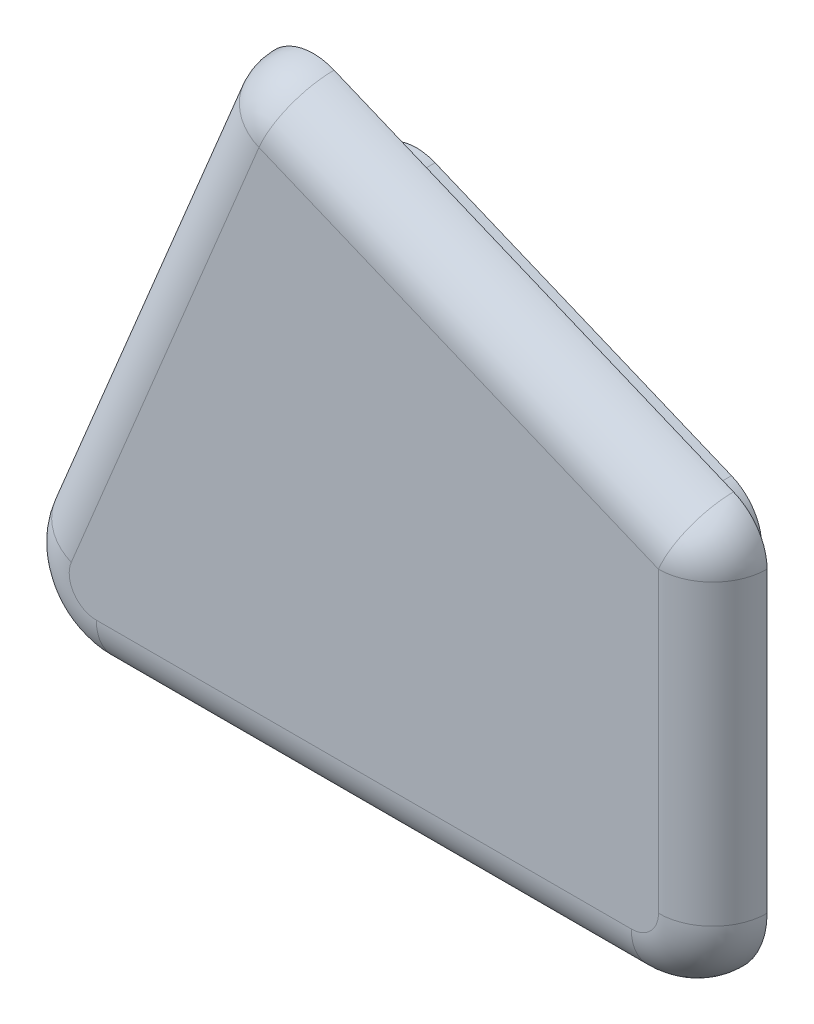
ISO-10303-21;
HEADER;
FILE_DESCRIPTION(('STEP AP214'),'2;1');
FILE_NAME('part.step','',(''),(''),'','','');
FILE_SCHEMA(('AUTOMOTIVE_DESIGN { 1 0 10303 214 1 1 1 1 }'));
ENDSEC;
DATA;
#1=APPLICATION_CONTEXT('core data for automotive mechanical design processes');
#2=APPLICATION_PROTOCOL_DEFINITION('international standard','automotive_design',2000,#1);
#3=PRODUCT_CONTEXT('',#1,'mechanical');
#4=PRODUCT('Part','Part','',(#3));
#5=PRODUCT_RELATED_PRODUCT_CATEGORY('part','',(#4));
#6=PRODUCT_DEFINITION_FORMATION('','',#4);
#7=PRODUCT_DEFINITION_CONTEXT('part definition',#1,'design');
#8=PRODUCT_DEFINITION('design','',#6,#7);
#9=PRODUCT_DEFINITION_SHAPE('','',#8);
#10=(LENGTH_UNIT() NAMED_UNIT(*) SI_UNIT(.MILLI.,.METRE.));
#11=(NAMED_UNIT(*) PLANE_ANGLE_UNIT() SI_UNIT($,.RADIAN.));
#12=(NAMED_UNIT(*) SI_UNIT($,.STERADIAN.) SOLID_ANGLE_UNIT());
#13=UNCERTAINTY_MEASURE_WITH_UNIT(LENGTH_MEASURE(1.E-05),#10,'distance_accuracy_value','');
#14=(GEOMETRIC_REPRESENTATION_CONTEXT(3) GLOBAL_UNCERTAINTY_ASSIGNED_CONTEXT((#13)) GLOBAL_UNIT_ASSIGNED_CONTEXT((#10,
#11,#12)) REPRESENTATION_CONTEXT('',''));
#15=CARTESIAN_POINT('',(0.,0.,0.));
#16=DIRECTION('',(0.,0.,1.));
#17=DIRECTION('',(1.,0.,0.));
#18=AXIS2_PLACEMENT_3D('',#15,#16,#17);
#19=CARTESIAN_POINT('',(0.,0.,0.));
#20=DIRECTION('',(0.,0.,1.));
#21=DIRECTION('',(1.,0.,0.));
#22=AXIS2_PLACEMENT_3D('',#19,#20,#21);
#23=PLANE('',#22);
#24=DIRECTION('',(0.,1.,0.));
#25=VECTOR('',#24,1.);
#26=CARTESIAN_POINT('',(32.1460132044939,0.,0.));
#27=LINE('',#26,#25);
#28=CARTESIAN_POINT('',(32.1460132044939,7.5,0.));
#29=VERTEX_POINT('',#28);
#30=CARTESIAN_POINT('',(32.1460132044939,34.934018325252,0.));
#31=VERTEX_POINT('',#30);
#32=EDGE_CURVE('E205',#29,#31,#27,.T.);
#33=ORIENTED_EDGE('',*,*,#32,.F.);
#34=CARTESIAN_POINT('',(24.6460132044939,7.5,0.));
#35=DIRECTION('',(0.,0.,1.));
#36=DIRECTION('',(1.,0.,0.));
#37=AXIS2_PLACEMENT_3D('',#34,#35,#36);
#38=CIRCLE('',#37,7.5);
#39=CARTESIAN_POINT('',(24.6460132044939,0.,0.));
#40=VERTEX_POINT('',#39);
#41=EDGE_CURVE('E237',#40,#29,#38,.T.);
#42=ORIENTED_EDGE('',*,*,#41,.F.);
#43=DIRECTION('',(1.,0.,0.));
#44=VECTOR('',#43,1.);
#45=CARTESIAN_POINT('',(0.,0.,0.));
#46=LINE('',#45,#44);
#47=CARTESIAN_POINT('',(-24.5995694192821,0.,0.));
#48=VERTEX_POINT('',#47);
#49=EDGE_CURVE('E234',#48,#40,#46,.T.);
#50=ORIENTED_EDGE('',*,*,#49,.F.);
#51=CARTESIAN_POINT('',(-24.5995694192821,7.5,0.));
#52=DIRECTION('',(0.,0.,1.));
#53=DIRECTION('',(1.,0.,0.));
#54=AXIS2_PLACEMENT_3D('',#51,#52,#53);
#55=CIRCLE('',#54,7.5);
#56=CARTESIAN_POINT('',(-31.5286659131167,10.3701257427382,0.));
#57=VERTEX_POINT('',#56);
#58=EDGE_CURVE('E231',#57,#48,#55,.T.);
#59=ORIENTED_EDGE('',*,*,#58,.F.);
#60=DIRECTION('',(-0.382683432365094,-0.923879532511285,0.));
#61=VECTOR('',#60,1.);
#62=CARTESIAN_POINT('',(-30.577792808247,12.6657364886105,0.));
#63=LINE('',#62,#61);
#64=CARTESIAN_POINT('',(-14.251310589598,52.0813512867155,0.));
#65=VERTEX_POINT('',#64);
#66=EDGE_CURVE('E228',#65,#57,#63,.T.);
#67=ORIENTED_EDGE('',*,*,#66,.F.);
#68=CARTESIAN_POINT('',(-9.6319129270416,50.16793412489,0.));
#69=DIRECTION('',(0.,0.,1.));
#70=DIRECTION('',(1.,0.,0.));
#71=AXIS2_PLACEMENT_3D('',#68,#69,#70);
#72=CIRCLE('',#71,5.);
#73=CARTESIAN_POINT('',(-7.71849576521614,54.7873317874464,0.));
#74=VERTEX_POINT('',#73);
#75=EDGE_CURVE('E225',#74,#65,#72,.T.);
#76=ORIENTED_EDGE('',*,*,#75,.F.);
#77=DIRECTION('',(-0.923879532511285,0.382683432365094,0.));
#78=VECTOR('',#77,1.);
#79=CARTESIAN_POINT('',(18.2398993804744,44.0350124606614,0.));
#80=LINE('',#79,#78);
#81=CARTESIAN_POINT('',(29.0594303663194,39.5534159878084,0.));
#82=VERTEX_POINT('',#81);
#83=EDGE_CURVE('E222',#82,#74,#80,.T.);
#84=ORIENTED_EDGE('',*,*,#83,.F.);
#85=CARTESIAN_POINT('',(27.1460132044939,34.934018325252,0.));
#86=DIRECTION('',(0.,0.,1.));
#87=DIRECTION('',(1.,0.,0.));
#88=AXIS2_PLACEMENT_3D('',#85,#86,#87);
#89=CIRCLE('',#88,5.);
#90=EDGE_CURVE('E219',#31,#82,#89,.T.);
#91=ORIENTED_EDGE('',*,*,#90,.F.);
#92=EDGE_LOOP('',(#33,#42,#50,#59,#67,#76,#84,#91));
#93=FACE_BOUND('',#92,.T.);
#94=DIRECTION('',(0.,-1.,0.));
#95=VECTOR('',#94,1.);
#96=CARTESIAN_POINT('',(26.6460132044939,0.,0.));
#97=LINE('',#96,#95);
#98=CARTESIAN_POINT('',(26.6460132044939,31.5931251356555,0.));
#99=VERTEX_POINT('',#98);
#100=CARTESIAN_POINT('',(26.6460132044939,15.,0.));
#101=VERTEX_POINT('',#100);
#102=EDGE_CURVE('E184',#99,#101,#97,.T.);
#103=ORIENTED_EDGE('',*,*,#102,.F.);
#104=CARTESIAN_POINT('',(22.1460132044939,31.5931251356555,0.));
#105=DIRECTION('',(0.,0.,1.));
#106=DIRECTION('',(1.,0.,0.));
#107=AXIS2_PLACEMENT_3D('',#104,#105,#106);
#108=CIRCLE('',#107,4.5);
#109=CARTESIAN_POINT('',(23.8680886501368,35.7505830319563,0.));
#110=VERTEX_POINT('',#109);
#111=EDGE_CURVE('E148',#99,#110,#108,.T.);
#112=ORIENTED_EDGE('',*,*,#111,.T.);
#113=DIRECTION('',(0.923879532511285,-0.382683432365094,0.));
#114=VECTOR('',#113,1.);
#115=CARTESIAN_POINT('',(16.1351405024664,38.9536750318493,0.));
#116=LINE('',#115,#114);
#117=CARTESIAN_POINT('',(-3.42160421377461,47.0543439291848,0.));
#118=VERTEX_POINT('',#117);
#119=EDGE_CURVE('E187',#118,#110,#116,.T.);
#120=ORIENTED_EDGE('',*,*,#119,.F.);
#121=CARTESIAN_POINT('',(-5.14367965941753,42.896886032884,0.));
#122=DIRECTION('',(0.,0.,1.));
#123=DIRECTION('',(1.,0.,0.));
#124=AXIS2_PLACEMENT_3D('',#121,#122,#123);
#125=CIRCLE('',#124,4.5);
#126=CARTESIAN_POINT('',(-9.30113755571831,44.6189614785269,0.));
#127=VERTEX_POINT('',#126);
#128=EDGE_CURVE('E190',#118,#127,#125,.T.);
#129=ORIENTED_EDGE('',*,*,#128,.T.);
#130=DIRECTION('',(0.382683432365094,0.923879532511285,0.));
#131=VECTOR('',#130,1.);
#132=CARTESIAN_POINT('',(-23.7142026125418,9.8227443429784,0.));
#133=LINE('',#132,#131);
#134=CARTESIAN_POINT('',(-22.7510293496796,12.1480502970953,0.));
#135=VERTEX_POINT('',#134);
#136=EDGE_CURVE('E193',#135,#127,#133,.T.);
#137=ORIENTED_EDGE('',*,*,#136,.F.);
#138=CARTESIAN_POINT('',(-19.9793907521458,11.,0.));
#139=DIRECTION('',(0.,0.,1.));
#140=DIRECTION('',(1.,0.,0.));
#141=AXIS2_PLACEMENT_3D('',#138,#139,#140);
#142=CIRCLE('',#141,3.);
#143=CARTESIAN_POINT('',(-19.9793907521458,8.,0.));
#144=VERTEX_POINT('',#143);
#145=EDGE_CURVE('E196',#135,#144,#142,.T.);
#146=ORIENTED_EDGE('',*,*,#145,.T.);
#147=DIRECTION('',(1.,0.,0.));
#148=VECTOR('',#147,1.);
#149=CARTESIAN_POINT('',(0.,8.,0.));
#150=LINE('',#149,#148);
#151=CARTESIAN_POINT('',(19.6460132044939,8.,0.));
#152=VERTEX_POINT('',#151);
#153=EDGE_CURVE('E199',#144,#152,#150,.T.);
#154=ORIENTED_EDGE('',*,*,#153,.T.);
#155=CARTESIAN_POINT('',(19.6460132044939,15.,0.));
#156=DIRECTION('',(0.,0.,1.));
#157=DIRECTION('',(1.,0.,0.));
#158=AXIS2_PLACEMENT_3D('',#155,#156,#157);
#159=CIRCLE('',#158,7.);
#160=EDGE_CURVE('E162',#152,#101,#159,.T.);
#161=ORIENTED_EDGE('',*,*,#160,.T.);
#162=EDGE_LOOP('',(#103,#112,#120,#129,#137,#146,#154,#161));
#163=FACE_BOUND('',#162,.T.);
#164=ADVANCED_FACE('F35',(#93,#163),#23,.F.);
#165=CARTESIAN_POINT('',(0.,0.,5.));
#166=DIRECTION('',(0.,0.,1.));
#167=DIRECTION('',(1.,0.,0.));
#168=AXIS2_PLACEMENT_3D('',#165,#166,#167);
#169=PLANE('',#168);
#170=DIRECTION('',(1.,0.,0.));
#171=VECTOR('',#170,1.);
#172=CARTESIAN_POINT('',(24.6460132044939,5.,5.));
#173=LINE('',#172,#171);
#174=CARTESIAN_POINT('',(-24.5995694192821,5.,5.));
#175=VERTEX_POINT('',#174);
#176=CARTESIAN_POINT('',(24.6460132044939,5.,5.));
#177=VERTEX_POINT('',#176);
#178=EDGE_CURVE('E44',#175,#177,#173,.T.);
#179=ORIENTED_EDGE('',*,*,#178,.T.);
#180=CARTESIAN_POINT('',(24.6460132044939,7.5,5.));
#181=DIRECTION('',(0.,0.,1.));
#182=DIRECTION('',(1.,0.,0.));
#183=AXIS2_PLACEMENT_3D('',#180,#181,#182);
#184=CIRCLE('',#183,2.5);
#185=CARTESIAN_POINT('',(27.1460132044939,7.5,5.));
#186=VERTEX_POINT('',#185);
#187=EDGE_CURVE('E11',#177,#186,#184,.T.);
#188=ORIENTED_EDGE('',*,*,#187,.T.);
#189=DIRECTION('',(0.,1.,0.));
#190=VECTOR('',#189,1.);
#191=CARTESIAN_POINT('',(27.1460132044939,34.934018325252,5.));
#192=LINE('',#191,#190);
#193=CARTESIAN_POINT('',(27.1460132044939,34.934018325252,5.));
#194=VERTEX_POINT('',#193);
#195=EDGE_CURVE('E240',#186,#194,#192,.T.);
#196=ORIENTED_EDGE('',*,*,#195,.T.);
#197=DIRECTION('',(-0.923879532511285,0.382683432365094,0.));
#198=VECTOR('',#197,1.);
#199=CARTESIAN_POINT('',(-9.63191292704161,50.16793412489,5.));
#200=LINE('',#199,#198);
#201=CARTESIAN_POINT('',(-9.6319129270416,50.16793412489,5.));
#202=VERTEX_POINT('',#201);
#203=EDGE_CURVE('E242',#194,#202,#200,.T.);
#204=ORIENTED_EDGE('',*,*,#203,.T.);
#205=DIRECTION('',(-0.382683432365094,-0.923879532511285,0.));
#206=VECTOR('',#205,1.);
#207=CARTESIAN_POINT('',(-26.9092682505603,8.45670858091273,5.));
#208=LINE('',#207,#206);
#209=CARTESIAN_POINT('',(-26.9092682505603,8.45670858091274,5.));
#210=VERTEX_POINT('',#209);
#211=EDGE_CURVE('E244',#202,#210,#208,.T.);
#212=ORIENTED_EDGE('',*,*,#211,.T.);
#213=CARTESIAN_POINT('',(-24.5995694192821,7.5,5.));
#214=DIRECTION('',(0.,0.,1.));
#215=DIRECTION('',(1.,0.,0.));
#216=AXIS2_PLACEMENT_3D('',#213,#214,#215);
#217=CIRCLE('',#216,2.5);
#218=EDGE_CURVE('E55',#210,#175,#217,.T.);
#219=ORIENTED_EDGE('',*,*,#218,.T.);
#220=EDGE_LOOP('',(#179,#188,#196,#204,#212,#219));
#221=FACE_BOUND('',#220,.T.);
#222=ADVANCED_FACE('F288',(#221),#169,.T.);
#223=CARTESIAN_POINT('',(26.6460132044939,0.,-5.));
#224=DIRECTION('',(-1.,0.,0.));
#225=DIRECTION('',(0.,0.,1.));
#226=AXIS2_PLACEMENT_3D('',#223,#224,#225);
#227=PLANE('',#226);
#228=ORIENTED_EDGE('',*,*,#102,.T.);
#229=DIRECTION('',(0.,0.,1.));
#230=VECTOR('',#229,1.);
#231=CARTESIAN_POINT('',(26.6460132044939,15.,-5.));
#232=LINE('',#231,#230);
#233=CARTESIAN_POINT('',(26.6460132044939,15.,-5.));
#234=VERTEX_POINT('',#233);
#235=EDGE_CURVE('E158',#234,#101,#232,.T.);
#236=ORIENTED_EDGE('',*,*,#235,.F.);
#237=DIRECTION('',(0.,-1.,0.));
#238=VECTOR('',#237,1.);
#239=CARTESIAN_POINT('',(26.6460132044939,0.,-5.));
#240=LINE('',#239,#238);
#241=CARTESIAN_POINT('',(26.6460132044939,31.5931251356555,-5.));
#242=VERTEX_POINT('',#241);
#243=EDGE_CURVE('E155',#242,#234,#240,.T.);
#244=ORIENTED_EDGE('',*,*,#243,.F.);
#245=DIRECTION('',(0.,0.,1.));
#246=VECTOR('',#245,1.);
#247=CARTESIAN_POINT('',(26.6460132044939,31.5931251356555,-5.));
#248=LINE('',#247,#246);
#249=EDGE_CURVE('E142',#242,#99,#248,.T.);
#250=ORIENTED_EDGE('',*,*,#249,.T.);
#251=EDGE_LOOP('',(#228,#236,#244,#250));
#252=FACE_BOUND('',#251,.T.);
#253=ADVANCED_FACE('F156',(#252),#227,.F.);
#254=CARTESIAN_POINT('',(19.6460132044939,15.,-5.));
#255=DIRECTION('',(0.,0.,1.));
#256=DIRECTION('',(1.,0.,0.));
#257=AXIS2_PLACEMENT_3D('',#254,#255,#256);
#258=CYLINDRICAL_SURFACE('',#257,7.);
#259=ORIENTED_EDGE('',*,*,#160,.F.);
#260=DIRECTION('',(0.,0.,1.));
#261=VECTOR('',#260,1.);
#262=CARTESIAN_POINT('',(19.6460132044939,8.,-5.));
#263=LINE('',#262,#261);
#264=CARTESIAN_POINT('',(19.6460132044939,8.,-5.));
#265=VERTEX_POINT('',#264);
#266=EDGE_CURVE('E206',#265,#152,#263,.T.);
#267=ORIENTED_EDGE('',*,*,#266,.F.);
#268=CARTESIAN_POINT('',(19.6460132044939,15.,-5.));
#269=DIRECTION('',(0.,0.,1.));
#270=DIRECTION('',(1.,0.,0.));
#271=AXIS2_PLACEMENT_3D('',#268,#269,#270);
#272=CIRCLE('',#271,7.);
#273=EDGE_CURVE('E152',#265,#234,#272,.T.);
#274=ORIENTED_EDGE('',*,*,#273,.T.);
#275=ORIENTED_EDGE('',*,*,#235,.T.);
#276=EDGE_LOOP('',(#259,#267,#274,#275));
#277=FACE_BOUND('',#276,.T.);
#278=ADVANCED_FACE('F312',(#277),#258,.T.);
#279=CARTESIAN_POINT('',(0.,8.,-5.));
#280=DIRECTION('',(0.,-1.,0.));
#281=DIRECTION('',(0.,0.,-1.));
#282=AXIS2_PLACEMENT_3D('',#279,#280,#281);
#283=PLANE('',#282);
#284=ORIENTED_EDGE('',*,*,#153,.F.);
#285=DIRECTION('',(0.,0.,1.));
#286=VECTOR('',#285,1.);
#287=CARTESIAN_POINT('',(-19.9793907521458,8.,-5.));
#288=LINE('',#287,#286);
#289=CARTESIAN_POINT('',(-19.9793907521458,8.,-5.));
#290=VERTEX_POINT('',#289);
#291=EDGE_CURVE('E208',#290,#144,#288,.T.);
#292=ORIENTED_EDGE('',*,*,#291,.F.);
#293=DIRECTION('',(1.,0.,0.));
#294=VECTOR('',#293,1.);
#295=CARTESIAN_POINT('',(0.,8.,-5.));
#296=LINE('',#295,#294);
#297=EDGE_CURVE('E180',#290,#265,#296,.T.);
#298=ORIENTED_EDGE('',*,*,#297,.T.);
#299=ORIENTED_EDGE('',*,*,#266,.T.);
#300=EDGE_LOOP('',(#284,#292,#298,#299));
#301=FACE_BOUND('',#300,.T.);
#302=ADVANCED_FACE('F330',(#301),#283,.T.);
#303=CARTESIAN_POINT('',(-19.9793907521458,11.,-5.));
#304=DIRECTION('',(0.,0.,1.));
#305=DIRECTION('',(1.,0.,0.));
#306=AXIS2_PLACEMENT_3D('',#303,#304,#305);
#307=CYLINDRICAL_SURFACE('',#306,3.);
#308=ORIENTED_EDGE('',*,*,#145,.F.);
#309=DIRECTION('',(0.,0.,1.));
#310=VECTOR('',#309,1.);
#311=CARTESIAN_POINT('',(-22.7510293496796,12.1480502970953,-5.));
#312=LINE('',#311,#310);
#313=CARTESIAN_POINT('',(-22.7510293496796,12.1480502970953,-5.));
#314=VERTEX_POINT('',#313);
#315=EDGE_CURVE('E210',#314,#135,#312,.T.);
#316=ORIENTED_EDGE('',*,*,#315,.F.);
#317=CARTESIAN_POINT('',(-19.9793907521458,11.,-5.));
#318=DIRECTION('',(0.,0.,1.));
#319=DIRECTION('',(1.,0.,0.));
#320=AXIS2_PLACEMENT_3D('',#317,#318,#319);
#321=CIRCLE('',#320,3.);
#322=EDGE_CURVE('E177',#314,#290,#321,.T.);
#323=ORIENTED_EDGE('',*,*,#322,.T.);
#324=ORIENTED_EDGE('',*,*,#291,.T.);
#325=EDGE_LOOP('',(#308,#316,#323,#324));
#326=FACE_BOUND('',#325,.T.);
#327=ADVANCED_FACE('F326',(#326),#307,.T.);
#328=CARTESIAN_POINT('',(-23.7142026125418,9.8227443429784,-5.));
#329=DIRECTION('',(0.923879532511285,-0.382683432365094,0.));
#330=DIRECTION('',(0.382683432365094,0.923879532511285,0.));
#331=AXIS2_PLACEMENT_3D('',#328,#329,#330);
#332=PLANE('',#331);
#333=ORIENTED_EDGE('',*,*,#136,.T.);
#334=DIRECTION('',(0.,0.,1.));
#335=VECTOR('',#334,1.);
#336=CARTESIAN_POINT('',(-9.30113755571831,44.6189614785269,-5.));
#337=LINE('',#336,#335);
#338=CARTESIAN_POINT('',(-9.30113755571831,44.6189614785269,-5.));
#339=VERTEX_POINT('',#338);
#340=EDGE_CURVE('E212',#339,#127,#337,.T.);
#341=ORIENTED_EDGE('',*,*,#340,.F.);
#342=DIRECTION('',(0.382683432365094,0.923879532511285,0.));
#343=VECTOR('',#342,1.);
#344=CARTESIAN_POINT('',(-23.7142026125418,9.8227443429784,-5.));
#345=LINE('',#344,#343);
#346=EDGE_CURVE('E175',#314,#339,#345,.T.);
#347=ORIENTED_EDGE('',*,*,#346,.F.);
#348=ORIENTED_EDGE('',*,*,#315,.T.);
#349=EDGE_LOOP('',(#333,#341,#347,#348));
#350=FACE_BOUND('',#349,.T.);
#351=ADVANCED_FACE('F322',(#350),#332,.F.);
#352=CARTESIAN_POINT('',(-5.14367965941753,42.896886032884,-5.));
#353=DIRECTION('',(0.,0.,1.));
#354=DIRECTION('',(1.,0.,0.));
#355=AXIS2_PLACEMENT_3D('',#352,#353,#354);
#356=CYLINDRICAL_SURFACE('',#355,4.5);
#357=ORIENTED_EDGE('',*,*,#128,.F.);
#358=DIRECTION('',(0.,0.,1.));
#359=VECTOR('',#358,1.);
#360=CARTESIAN_POINT('',(-3.42160421377461,47.0543439291848,-5.));
#361=LINE('',#360,#359);
#362=CARTESIAN_POINT('',(-3.42160421377461,47.0543439291848,-5.));
#363=VERTEX_POINT('',#362);
#364=EDGE_CURVE('E214',#363,#118,#361,.T.);
#365=ORIENTED_EDGE('',*,*,#364,.F.);
#366=CARTESIAN_POINT('',(-5.14367965941753,42.896886032884,-5.));
#367=DIRECTION('',(0.,0.,1.));
#368=DIRECTION('',(1.,0.,0.));
#369=AXIS2_PLACEMENT_3D('',#366,#367,#368);
#370=CIRCLE('',#369,4.5);
#371=EDGE_CURVE('E170',#363,#339,#370,.T.);
#372=ORIENTED_EDGE('',*,*,#371,.T.);
#373=ORIENTED_EDGE('',*,*,#340,.T.);
#374=EDGE_LOOP('',(#357,#365,#372,#373));
#375=FACE_BOUND('',#374,.T.);
#376=ADVANCED_FACE('F318',(#375),#356,.T.);
#377=CARTESIAN_POINT('',(16.1351405024664,38.9536750318493,-5.));
#378=DIRECTION('',(-0.382683432365094,-0.923879532511285,0.));
#379=DIRECTION('',(0.923879532511285,-0.382683432365094,0.));
#380=AXIS2_PLACEMENT_3D('',#377,#378,#379);
#381=PLANE('',#380);
#382=ORIENTED_EDGE('',*,*,#119,.T.);
#383=DIRECTION('',(0.,0.,1.));
#384=VECTOR('',#383,1.);
#385=CARTESIAN_POINT('',(23.8680886501368,35.7505830319563,-5.));
#386=LINE('',#385,#384);
#387=CARTESIAN_POINT('',(23.8680886501368,35.7505830319563,-5.));
#388=VERTEX_POINT('',#387);
#389=EDGE_CURVE('E151',#388,#110,#386,.T.);
#390=ORIENTED_EDGE('',*,*,#389,.F.);
#391=DIRECTION('',(0.923879532511285,-0.382683432365094,0.));
#392=VECTOR('',#391,1.);
#393=CARTESIAN_POINT('',(16.1351405024664,38.9536750318493,-5.));
#394=LINE('',#393,#392);
#395=EDGE_CURVE('E167',#363,#388,#394,.T.);
#396=ORIENTED_EDGE('',*,*,#395,.F.);
#397=ORIENTED_EDGE('',*,*,#364,.T.);
#398=EDGE_LOOP('',(#382,#390,#396,#397));
#399=FACE_BOUND('',#398,.T.);
#400=ADVANCED_FACE('F315',(#399),#381,.F.);
#401=CARTESIAN_POINT('',(22.1460132044939,31.5931251356555,-5.));
#402=DIRECTION('',(0.,0.,1.));
#403=DIRECTION('',(1.,0.,0.));
#404=AXIS2_PLACEMENT_3D('',#401,#402,#403);
#405=CYLINDRICAL_SURFACE('',#404,4.5);
#406=ORIENTED_EDGE('',*,*,#111,.F.);
#407=ORIENTED_EDGE('',*,*,#249,.F.);
#408=CARTESIAN_POINT('',(22.1460132044939,31.5931251356555,-5.));
#409=DIRECTION('',(0.,0.,1.));
#410=DIRECTION('',(1.,0.,0.));
#411=AXIS2_PLACEMENT_3D('',#408,#409,#410);
#412=CIRCLE('',#411,4.5);
#413=EDGE_CURVE('E146',#242,#388,#412,.T.);
#414=ORIENTED_EDGE('',*,*,#413,.T.);
#415=ORIENTED_EDGE('',*,*,#389,.T.);
#416=EDGE_LOOP('',(#406,#407,#414,#415));
#417=FACE_BOUND('',#416,.T.);
#418=ADVANCED_FACE('F144',(#417),#405,.T.);
#419=CARTESIAN_POINT('',(0.,0.,-5.));
#420=DIRECTION('',(0.,0.,1.));
#421=DIRECTION('',(1.,0.,0.));
#422=AXIS2_PLACEMENT_3D('',#419,#420,#421);
#423=PLANE('',#422);
#424=ORIENTED_EDGE('',*,*,#243,.T.);
#425=ORIENTED_EDGE('',*,*,#273,.F.);
#426=ORIENTED_EDGE('',*,*,#297,.F.);
#427=ORIENTED_EDGE('',*,*,#322,.F.);
#428=ORIENTED_EDGE('',*,*,#346,.T.);
#429=ORIENTED_EDGE('',*,*,#371,.F.);
#430=ORIENTED_EDGE('',*,*,#395,.T.);
#431=ORIENTED_EDGE('',*,*,#413,.F.);
#432=EDGE_LOOP('',(#424,#425,#426,#427,#428,#429,#430,#431));
#433=FACE_BOUND('',#432,.T.);
#434=ADVANCED_FACE('F164',(#433),#423,.F.);
#435=CARTESIAN_POINT('',(-9.6319129270416,50.16793412489,0.));
#436=DIRECTION('',(0.,0.,1.));
#437=DIRECTION('',(1.,0.,0.));
#438=AXIS2_PLACEMENT_3D('',#435,#436,#437);
#439=SPHERICAL_SURFACE('',#438,5.);
#440=CARTESIAN_POINT('',(-9.6319129270416,50.16793412489,0.));
#441=DIRECTION('',(0.923879532511286,-0.382683432365092,0.));
#442=DIRECTION('',(0.382683432365092,0.923879532511286,0.));
#443=AXIS2_PLACEMENT_3D('',#440,#441,#442);
#444=CIRCLE('',#443,5.);
#445=EDGE_CURVE('E263',#74,#202,#444,.T.);
#446=ORIENTED_EDGE('',*,*,#445,.F.);
#447=ORIENTED_EDGE('',*,*,#75,.T.);
#448=CARTESIAN_POINT('',(-9.6319129270416,50.16793412489,0.));
#449=DIRECTION('',(-0.382683432365094,-0.923879532511285,0.));
#450=DIRECTION('',(0.923879532511285,-0.382683432365094,0.));
#451=AXIS2_PLACEMENT_3D('',#448,#449,#450);
#452=CIRCLE('',#451,5.);
#453=EDGE_CURVE('E39',#202,#65,#452,.T.);
#454=ORIENTED_EDGE('',*,*,#453,.F.);
#455=EDGE_LOOP('',(#446,#447,#454));
#456=FACE_BOUND('',#455,.T.);
#457=ADVANCED_FACE('F37',(#456),#439,.T.);
#458=CARTESIAN_POINT('',(-25.9583951456905,10.7523193267851,0.));
#459=DIRECTION('',(0.382683432365094,0.923879532511285,0.));
#460=DIRECTION('',(-0.923879532511285,0.382683432365094,0.));
#461=AXIS2_PLACEMENT_3D('',#458,#459,#460);
#462=CYLINDRICAL_SURFACE('',#461,5.);
#463=ORIENTED_EDGE('',*,*,#453,.T.);
#464=ORIENTED_EDGE('',*,*,#66,.T.);
#465=CARTESIAN_POINT('',(-26.9092682505603,8.45670858091274,0.));
#466=DIRECTION('',(-0.382683432365093,-0.923879532511285,0.));
#467=DIRECTION('',(0.923879532511285,-0.382683432365093,0.));
#468=AXIS2_PLACEMENT_3D('',#465,#466,#467);
#469=CIRCLE('',#468,5.);
#470=EDGE_CURVE('E261',#210,#57,#469,.T.);
#471=ORIENTED_EDGE('',*,*,#470,.F.);
#472=ORIENTED_EDGE('',*,*,#211,.F.);
#473=EDGE_LOOP('',(#463,#464,#471,#472));
#474=FACE_BOUND('',#473,.T.);
#475=ADVANCED_FACE('F272',(#474),#462,.T.);
#476=CARTESIAN_POINT('',(16.3264822186489,39.415614798105,0.));
#477=DIRECTION('',(0.923879532511285,-0.382683432365094,0.));
#478=DIRECTION('',(0.382683432365094,0.923879532511285,0.));
#479=AXIS2_PLACEMENT_3D('',#476,#477,#478);
#480=CYLINDRICAL_SURFACE('',#479,5.);
#481=ORIENTED_EDGE('',*,*,#445,.T.);
#482=ORIENTED_EDGE('',*,*,#203,.F.);
#483=CARTESIAN_POINT('',(27.1460132044939,34.934018325252,0.));
#484=DIRECTION('',(0.923879532511285,-0.382683432365094,0.));
#485=DIRECTION('',(0.382683432365094,0.923879532511285,0.));
#486=AXIS2_PLACEMENT_3D('',#483,#484,#485);
#487=CIRCLE('',#486,5.);
#488=EDGE_CURVE('E258',#82,#194,#487,.T.);
#489=ORIENTED_EDGE('',*,*,#488,.F.);
#490=ORIENTED_EDGE('',*,*,#83,.T.);
#491=EDGE_LOOP('',(#481,#482,#489,#490));
#492=FACE_BOUND('',#491,.T.);
#493=ADVANCED_FACE('F290',(#492),#480,.T.);
#494=CARTESIAN_POINT('',(-24.5995694192821,7.5,0.));
#495=DIRECTION('',(0.,0.,1.));
#496=DIRECTION('',(1.,0.,0.));
#497=AXIS2_PLACEMENT_3D('',#494,#495,#496);
#498=DEGENERATE_TOROIDAL_SURFACE('',#497,2.5,5.,.T.);
#499=ORIENTED_EDGE('',*,*,#470,.T.);
#500=ORIENTED_EDGE('',*,*,#58,.T.);
#501=CARTESIAN_POINT('',(-24.5995694192821,5.,0.));
#502=DIRECTION('',(1.,0.,0.));
#503=DIRECTION('',(0.,0.,-1.));
#504=AXIS2_PLACEMENT_3D('',#501,#502,#503);
#505=CIRCLE('',#504,5.);
#506=EDGE_CURVE('E255',#175,#48,#505,.T.);
#507=ORIENTED_EDGE('',*,*,#506,.F.);
#508=ORIENTED_EDGE('',*,*,#218,.F.);
#509=EDGE_LOOP('',(#499,#500,#507,#508));
#510=FACE_BOUND('',#509,.T.);
#511=ADVANCED_FACE('F280',(#510),#498,.T.);
#512=CARTESIAN_POINT('',(27.1460132044939,34.934018325252,0.));
#513=DIRECTION('',(0.,0.,1.));
#514=DIRECTION('',(1.,0.,0.));
#515=AXIS2_PLACEMENT_3D('',#512,#513,#514);
#516=SPHERICAL_SURFACE('',#515,5.);
#517=ORIENTED_EDGE('',*,*,#90,.T.);
#518=ORIENTED_EDGE('',*,*,#488,.T.);
#519=CARTESIAN_POINT('',(27.1460132044939,34.934018325252,0.));
#520=DIRECTION('',(0.,-1.,0.));
#521=DIRECTION('',(0.,0.,-1.));
#522=AXIS2_PLACEMENT_3D('',#519,#520,#521);
#523=CIRCLE('',#522,5.);
#524=EDGE_CURVE('E252',#31,#194,#523,.T.);
#525=ORIENTED_EDGE('',*,*,#524,.F.);
#526=EDGE_LOOP('',(#517,#518,#525));
#527=FACE_BOUND('',#526,.T.);
#528=ADVANCED_FACE('F293',(#527),#516,.T.);
#529=CARTESIAN_POINT('',(0.,5.,0.));
#530=DIRECTION('',(-1.,0.,0.));
#531=DIRECTION('',(0.,0.,1.));
#532=AXIS2_PLACEMENT_3D('',#529,#530,#531);
#533=CYLINDRICAL_SURFACE('',#532,5.);
#534=ORIENTED_EDGE('',*,*,#506,.T.);
#535=ORIENTED_EDGE('',*,*,#49,.T.);
#536=CARTESIAN_POINT('',(24.6460132044939,5.,0.));
#537=DIRECTION('',(1.,0.,0.));
#538=DIRECTION('',(0.,0.,-1.));
#539=AXIS2_PLACEMENT_3D('',#536,#537,#538);
#540=CIRCLE('',#539,5.);
#541=EDGE_CURVE('E250',#177,#40,#540,.T.);
#542=ORIENTED_EDGE('',*,*,#541,.F.);
#543=ORIENTED_EDGE('',*,*,#178,.F.);
#544=EDGE_LOOP('',(#534,#535,#542,#543));
#545=FACE_BOUND('',#544,.T.);
#546=ADVANCED_FACE('F282',(#545),#533,.T.);
#547=CARTESIAN_POINT('',(27.1460132044939,0.,0.));
#548=DIRECTION('',(0.,-1.,0.));
#549=DIRECTION('',(0.,0.,-1.));
#550=AXIS2_PLACEMENT_3D('',#547,#548,#549);
#551=CYLINDRICAL_SURFACE('',#550,5.);
#552=ORIENTED_EDGE('',*,*,#524,.T.);
#553=ORIENTED_EDGE('',*,*,#195,.F.);
#554=CARTESIAN_POINT('',(27.1460132044939,7.5,0.));
#555=DIRECTION('',(0.,-1.,0.));
#556=DIRECTION('',(0.,0.,-1.));
#557=AXIS2_PLACEMENT_3D('',#554,#555,#556);
#558=CIRCLE('',#557,5.);
#559=EDGE_CURVE('E248',#29,#186,#558,.T.);
#560=ORIENTED_EDGE('',*,*,#559,.F.);
#561=ORIENTED_EDGE('',*,*,#32,.T.);
#562=EDGE_LOOP('',(#552,#553,#560,#561));
#563=FACE_BOUND('',#562,.T.);
#564=ADVANCED_FACE('F294',(#563),#551,.T.);
#565=CARTESIAN_POINT('',(24.6460132044939,7.5,0.));
#566=DIRECTION('',(0.,0.,1.));
#567=DIRECTION('',(1.,0.,0.));
#568=AXIS2_PLACEMENT_3D('',#565,#566,#567);
#569=DEGENERATE_TOROIDAL_SURFACE('',#568,2.5,5.,.T.);
#570=ORIENTED_EDGE('',*,*,#541,.T.);
#571=ORIENTED_EDGE('',*,*,#41,.T.);
#572=ORIENTED_EDGE('',*,*,#559,.T.);
#573=ORIENTED_EDGE('',*,*,#187,.F.);
#574=EDGE_LOOP('',(#570,#571,#572,#573));
#575=FACE_BOUND('',#574,.T.);
#576=ADVANCED_FACE('F285',(#575),#569,.T.);
#577=CLOSED_SHELL('',(#164,#222,#253,#278,#302,#327,#351,#376,#400,#418,#434,#457,#475,#493,
#511,#528,#546,#564,#576));
#578=MANIFOLD_SOLID_BREP('B2',#577);
#579=ADVANCED_BREP_SHAPE_REPRESENTATION('',(#18,#578),#14);
#580=SHAPE_DEFINITION_REPRESENTATION(#9,#579);
ENDSEC;
END-ISO-10303-21;
